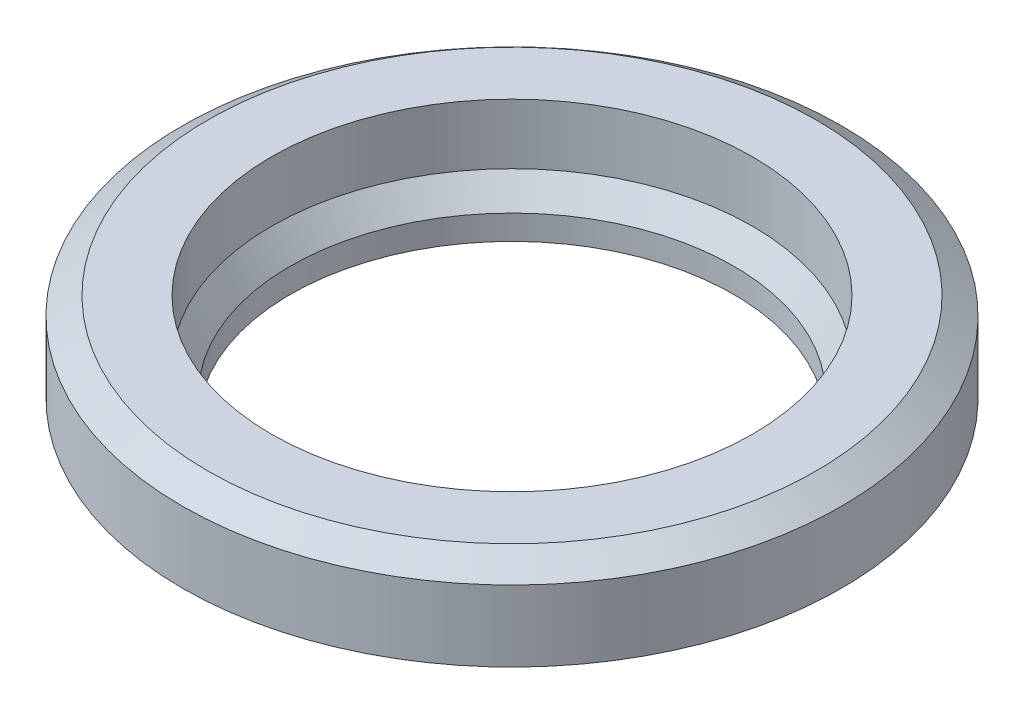
ISO-10303-21;
HEADER;
FILE_DESCRIPTION(('STEP AP214'),'2;1');
FILE_NAME('part.step','',(''),(''),'','','');
FILE_SCHEMA(('AUTOMOTIVE_DESIGN { 1 0 10303 214 1 1 1 1 }'));
ENDSEC;
DATA;
#1=APPLICATION_CONTEXT('core data for automotive mechanical design processes');
#2=APPLICATION_PROTOCOL_DEFINITION('international standard','automotive_design',2000,#1);
#3=PRODUCT_CONTEXT('',#1,'mechanical');
#4=PRODUCT('Part','Part','',(#3));
#5=PRODUCT_RELATED_PRODUCT_CATEGORY('part','',(#4));
#6=PRODUCT_DEFINITION_FORMATION('','',#4);
#7=PRODUCT_DEFINITION_CONTEXT('part definition',#1,'design');
#8=PRODUCT_DEFINITION('design','',#6,#7);
#9=PRODUCT_DEFINITION_SHAPE('','',#8);
#10=(LENGTH_UNIT() NAMED_UNIT(*) SI_UNIT(.MILLI.,.METRE.));
#11=(NAMED_UNIT(*) PLANE_ANGLE_UNIT() SI_UNIT($,.RADIAN.));
#12=(NAMED_UNIT(*) SI_UNIT($,.STERADIAN.) SOLID_ANGLE_UNIT());
#13=UNCERTAINTY_MEASURE_WITH_UNIT(LENGTH_MEASURE(1.E-05),#10,'distance_accuracy_value','');
#14=(GEOMETRIC_REPRESENTATION_CONTEXT(3) GLOBAL_UNCERTAINTY_ASSIGNED_CONTEXT((#13)) GLOBAL_UNIT_ASSIGNED_CONTEXT((#10,
#11,#12)) REPRESENTATION_CONTEXT('',''));
#15=CARTESIAN_POINT('',(0.,0.,0.));
#16=DIRECTION('',(0.,0.,1.));
#17=DIRECTION('',(1.,0.,0.));
#18=AXIS2_PLACEMENT_3D('',#15,#16,#17);
#19=CARTESIAN_POINT('',(0.,1.32202001308348,0.));
#20=DIRECTION('',(0.,1.,0.));
#21=DIRECTION('',(0.,0.,1.));
#22=AXIS2_PLACEMENT_3D('',#19,#20,#21);
#23=CONICAL_SURFACE('',#22,8.70868163690375,0.725174483579512);
#24=CARTESIAN_POINT('',(0.,0.985286046510149,0.));
#25=DIRECTION('',(0.,1.,0.));
#26=DIRECTION('',(0.,0.,1.));
#27=AXIS2_PLACEMENT_3D('',#24,#25,#26);
#28=CIRCLE('',#27,8.41024622063567);
#29=CARTESIAN_POINT('',(0.,0.985286046510149,8.41024622063567));
#30=VERTEX_POINT('',#29);
#31=EDGE_CURVE('E10',#30,#30,#28,.F.);
#32=ORIENTED_EDGE('',*,*,#31,.T.);
#33=EDGE_LOOP('',(#32));
#34=FACE_BOUND('',#33,.T.);
#35=CARTESIAN_POINT('',(0.,0.557253854871362,0.));
#36=DIRECTION('',(0.,1.,0.));
#37=DIRECTION('',(0.,0.,1.));
#38=AXIS2_PLACEMENT_3D('',#35,#36,#37);
#39=CIRCLE('',#38,8.03089641346366);
#40=CARTESIAN_POINT('',(0.,0.557253854871362,8.03089641346366));
#41=VERTEX_POINT('',#40);
#42=EDGE_CURVE('E85',#41,#41,#39,.T.);
#43=ORIENTED_EDGE('',*,*,#42,.T.);
#44=EDGE_LOOP('',(#43));
#45=FACE_BOUND('',#44,.T.);
#46=ADVANCED_FACE('F43',(#34,#45),#23,.T.);
#47=CARTESIAN_POINT('',(-8.70868163690375,1.32202001308347,0.));
#48=DIRECTION('',(0.,-1.,0.));
#49=DIRECTION('',(0.,0.,-1.));
#50=AXIS2_PLACEMENT_3D('',#47,#48,#49);
#51=PLANE('',#50);
#52=CARTESIAN_POINT('',(0.,1.32202001308347,0.));
#53=DIRECTION('',(0.,-1.,0.));
#54=DIRECTION('',(0.,0.,-1.));
#55=AXIS2_PLACEMENT_3D('',#52,#53,#54);
#56=CIRCLE('',#55,9.15862992496283);
#57=CARTESIAN_POINT('',(0.,1.32202001308347,-9.15862992496283));
#58=VERTEX_POINT('',#57);
#59=EDGE_CURVE('E51',#58,#58,#56,.F.);
#60=ORIENTED_EDGE('',*,*,#59,.T.);
#61=EDGE_LOOP('',(#60));
#62=FACE_BOUND('',#61,.T.);
#63=CARTESIAN_POINT('',(0.,1.32202001308348,0.));
#64=DIRECTION('',(0.,1.,0.));
#65=DIRECTION('',(0.,0.,1.));
#66=AXIS2_PLACEMENT_3D('',#63,#64,#65);
#67=CIRCLE('',#66,11.9372593674878);
#68=CARTESIAN_POINT('',(0.,1.32202001308348,11.9372593674878));
#69=VERTEX_POINT('',#68);
#70=EDGE_CURVE('E57',#69,#69,#67,.T.);
#71=ORIENTED_EDGE('',*,*,#70,.F.);
#72=EDGE_LOOP('',(#71));
#73=FACE_BOUND('',#72,.T.);
#74=ADVANCED_FACE('F106',(#62,#73),#51,.T.);
#75=CARTESIAN_POINT('',(0.,26.0986959657604,0.));
#76=DIRECTION('',(0.,1.,0.));
#77=DIRECTION('',(0.,0.,1.));
#78=AXIS2_PLACEMENT_3D('',#75,#76,#77);
#79=CYLINDRICAL_SURFACE('',#78,11.9372593674878);
#80=ORIENTED_EDGE('',*,*,#70,.T.);
#81=EDGE_LOOP('',(#80));
#82=FACE_BOUND('',#81,.T.);
#83=CARTESIAN_POINT('',(0.,3.89563773424862,0.));
#84=DIRECTION('',(0.,1.,0.));
#85=DIRECTION('',(0.,0.,1.));
#86=AXIS2_PLACEMENT_3D('',#83,#84,#85);
#87=CIRCLE('',#86,11.9372593674878);
#88=CARTESIAN_POINT('',(0.,3.89563773424862,11.9372593674878));
#89=VERTEX_POINT('',#88);
#90=EDGE_CURVE('E63',#89,#89,#87,.T.);
#91=ORIENTED_EDGE('',*,*,#90,.F.);
#92=EDGE_LOOP('',(#91));
#93=FACE_BOUND('',#92,.T.);
#94=ADVANCED_FACE('F110',(#82,#93),#79,.T.);
#95=CARTESIAN_POINT('',(0.,4.53930742408738,0.));
#96=DIRECTION('',(0.,-1.,0.));
#97=DIRECTION('',(0.,0.,-1.));
#98=AXIS2_PLACEMENT_3D('',#95,#96,#97);
#99=CONICAL_SURFACE('',#98,11.0155891507923,0.961163073844261);
#100=ORIENTED_EDGE('',*,*,#90,.T.);
#101=EDGE_LOOP('',(#100));
#102=FACE_BOUND('',#101,.T.);
#103=CARTESIAN_POINT('',(0.,4.53930742408738,0.));
#104=DIRECTION('',(0.,1.,0.));
#105=DIRECTION('',(0.,0.,1.));
#106=AXIS2_PLACEMENT_3D('',#103,#104,#105);
#107=CIRCLE('',#106,11.0155891507923);
#108=CARTESIAN_POINT('',(0.,4.53930742408738,11.0155891507923));
#109=VERTEX_POINT('',#108);
#110=EDGE_CURVE('E69',#109,#109,#107,.T.);
#111=ORIENTED_EDGE('',*,*,#110,.F.);
#112=EDGE_LOOP('',(#111));
#113=FACE_BOUND('',#112,.T.);
#114=ADVANCED_FACE('F115',(#102,#113),#99,.T.);
#115=CARTESIAN_POINT('',(-8.70868163690375,4.53930742408738,0.));
#116=DIRECTION('',(0.,1.,0.));
#117=DIRECTION('',(0.,0.,1.));
#118=AXIS2_PLACEMENT_3D('',#115,#116,#117);
#119=PLANE('',#118);
#120=ORIENTED_EDGE('',*,*,#110,.T.);
#121=EDGE_LOOP('',(#120));
#122=FACE_BOUND('',#121,.T.);
#123=CARTESIAN_POINT('',(0.,4.53930742408738,0.));
#124=DIRECTION('',(0.,1.,0.));
#125=DIRECTION('',(0.,0.,1.));
#126=AXIS2_PLACEMENT_3D('',#123,#124,#125);
#127=CIRCLE('',#126,8.70868163690375);
#128=CARTESIAN_POINT('',(0.,4.53930742408738,8.70868163690375));
#129=VERTEX_POINT('',#128);
#130=EDGE_CURVE('E73',#129,#129,#127,.T.);
#131=ORIENTED_EDGE('',*,*,#130,.F.);
#132=EDGE_LOOP('',(#131));
#133=FACE_BOUND('',#132,.T.);
#134=ADVANCED_FACE('F119',(#122,#133),#119,.T.);
#135=CARTESIAN_POINT('',(0.,26.0986959657604,0.));
#136=DIRECTION('',(0.,1.,0.));
#137=DIRECTION('',(0.,0.,1.));
#138=AXIS2_PLACEMENT_3D('',#135,#136,#137);
#139=CYLINDRICAL_SURFACE('',#138,8.70868163690375);
#140=ORIENTED_EDGE('',*,*,#130,.T.);
#141=EDGE_LOOP('',(#140));
#142=FACE_BOUND('',#141,.T.);
#143=CARTESIAN_POINT('',(0.,2.35869879103985,0.));
#144=DIRECTION('',(0.,1.,0.));
#145=DIRECTION('',(0.,0.,1.));
#146=AXIS2_PLACEMENT_3D('',#143,#144,#145);
#147=CIRCLE('',#146,8.70868163690375);
#148=CARTESIAN_POINT('',(0.,2.35869879103985,8.70868163690375));
#149=VERTEX_POINT('',#148);
#150=EDGE_CURVE('E77',#149,#149,#147,.T.);
#151=ORIENTED_EDGE('',*,*,#150,.F.);
#152=EDGE_LOOP('',(#151));
#153=FACE_BOUND('',#152,.T.);
#154=ADVANCED_FACE('F102',(#142,#153),#139,.F.);
#155=CARTESIAN_POINT('',(0.,1.44539226364254,0.));
#156=DIRECTION('',(0.,1.,0.));
#157=DIRECTION('',(0.,0.,1.));
#158=AXIS2_PLACEMENT_3D('',#155,#156,#157);
#159=CONICAL_SURFACE('',#158,8.03089641346366,0.638440345779888);
#160=ORIENTED_EDGE('',*,*,#150,.T.);
#161=EDGE_LOOP('',(#160));
#162=FACE_BOUND('',#161,.T.);
#163=CARTESIAN_POINT('',(0.,1.44539226364254,0.));
#164=DIRECTION('',(0.,1.,0.));
#165=DIRECTION('',(0.,0.,1.));
#166=AXIS2_PLACEMENT_3D('',#163,#164,#165);
#167=CIRCLE('',#166,8.03089641346366);
#168=CARTESIAN_POINT('',(0.,1.44539226364254,8.03089641346366));
#169=VERTEX_POINT('',#168);
#170=EDGE_CURVE('E81',#169,#169,#167,.T.);
#171=ORIENTED_EDGE('',*,*,#170,.F.);
#172=EDGE_LOOP('',(#171));
#173=FACE_BOUND('',#172,.T.);
#174=ADVANCED_FACE('F94',(#162,#173),#159,.F.);
#175=CARTESIAN_POINT('',(0.,26.0986959657604,0.));
#176=DIRECTION('',(0.,1.,0.));
#177=DIRECTION('',(0.,0.,1.));
#178=AXIS2_PLACEMENT_3D('',#175,#176,#177);
#179=CYLINDRICAL_SURFACE('',#178,8.03089641346366);
#180=ORIENTED_EDGE('',*,*,#170,.T.);
#181=EDGE_LOOP('',(#180));
#182=FACE_BOUND('',#181,.T.);
#183=ORIENTED_EDGE('',*,*,#42,.F.);
#184=EDGE_LOOP('',(#183));
#185=FACE_BOUND('',#184,.T.);
#186=ADVANCED_FACE('F92',(#182,#185),#179,.F.);
#187=CARTESIAN_POINT('',(0.,0.322020013083474,0.));
#188=DIRECTION('',(0.,-1.,0.));
#189=DIRECTION('',(0.,0.,-1.));
#190=AXIS2_PLACEMENT_3D('',#187,#188,#189);
#191=TOROIDAL_SURFACE('',#190,9.15862992496283,1.);
#192=ORIENTED_EDGE('',*,*,#31,.F.);
#193=EDGE_LOOP('',(#192));
#194=FACE_BOUND('',#193,.T.);
#195=ORIENTED_EDGE('',*,*,#59,.F.);
#196=EDGE_LOOP('',(#195));
#197=FACE_BOUND('',#196,.T.);
#198=ADVANCED_FACE('F45',(#194,#197),#191,.F.);
#199=CLOSED_SHELL('',(#46,#74,#94,#114,#134,#154,#174,#186,#198));
#200=MANIFOLD_SOLID_BREP('B2',#199);
#201=ADVANCED_BREP_SHAPE_REPRESENTATION('',(#18,#200),#14);
#202=SHAPE_DEFINITION_REPRESENTATION(#9,#201);
ENDSEC;
END-ISO-10303-21;
